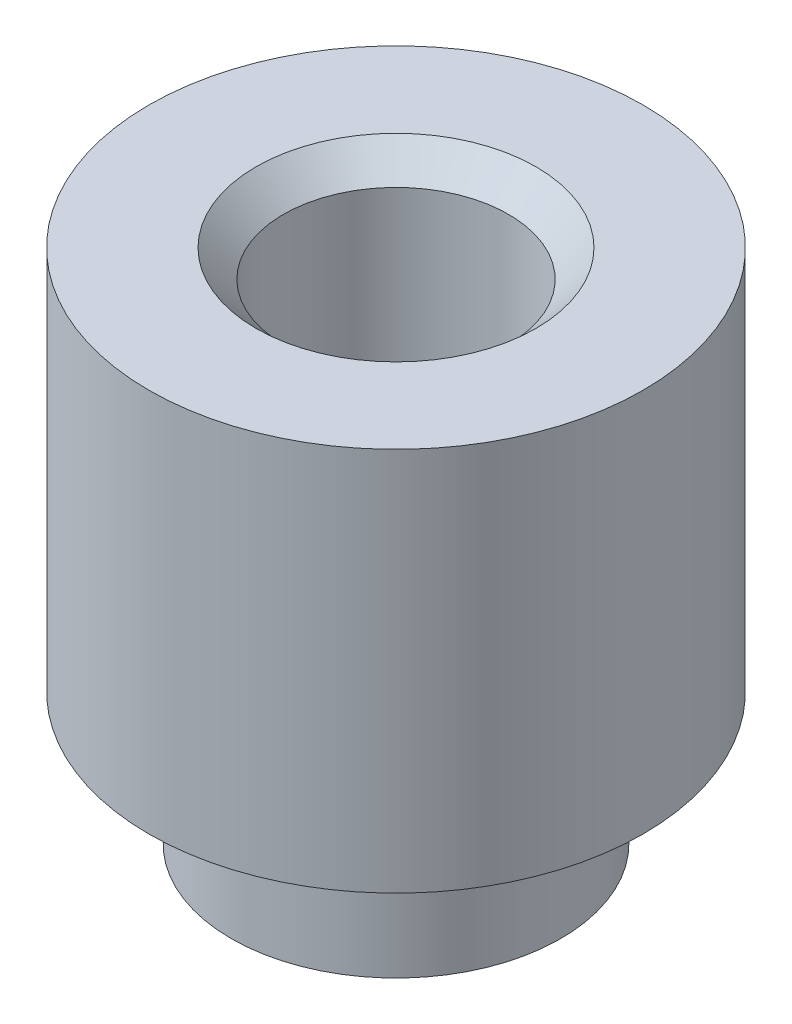
ISO-10303-21;
HEADER;
FILE_DESCRIPTION(('STEP AP214'),'2;1');
FILE_NAME('part.step','',(''),(''),'','','');
FILE_SCHEMA(('AUTOMOTIVE_DESIGN { 1 0 10303 214 1 1 1 1 }'));
ENDSEC;
DATA;
#1=APPLICATION_CONTEXT('core data for automotive mechanical design processes');
#2=APPLICATION_PROTOCOL_DEFINITION('international standard','automotive_design',2000,#1);
#3=PRODUCT_CONTEXT('',#1,'mechanical');
#4=PRODUCT('Part','Part','',(#3));
#5=PRODUCT_RELATED_PRODUCT_CATEGORY('part','',(#4));
#6=PRODUCT_DEFINITION_FORMATION('','',#4);
#7=PRODUCT_DEFINITION_CONTEXT('part definition',#1,'design');
#8=PRODUCT_DEFINITION('design','',#6,#7);
#9=PRODUCT_DEFINITION_SHAPE('','',#8);
#10=(LENGTH_UNIT() NAMED_UNIT(*) SI_UNIT(.MILLI.,.METRE.));
#11=(NAMED_UNIT(*) PLANE_ANGLE_UNIT() SI_UNIT($,.RADIAN.));
#12=(NAMED_UNIT(*) SI_UNIT($,.STERADIAN.) SOLID_ANGLE_UNIT());
#13=UNCERTAINTY_MEASURE_WITH_UNIT(LENGTH_MEASURE(1.E-05),#10,'distance_accuracy_value','');
#14=(GEOMETRIC_REPRESENTATION_CONTEXT(3) GLOBAL_UNCERTAINTY_ASSIGNED_CONTEXT((#13)) GLOBAL_UNIT_ASSIGNED_CONTEXT((#10,
#11,#12)) REPRESENTATION_CONTEXT('',''));
#15=CARTESIAN_POINT('',(0.,0.,0.));
#16=DIRECTION('',(0.,0.,1.));
#17=DIRECTION('',(1.,0.,0.));
#18=AXIS2_PLACEMENT_3D('',#15,#16,#17);
#19=CARTESIAN_POINT('',(0.,1.2,0.));
#20=DIRECTION('',(0.,-1.,0.));
#21=DIRECTION('',(0.,0.,-1.));
#22=AXIS2_PLACEMENT_3D('',#19,#20,#21);
#23=CYLINDRICAL_SURFACE('',#22,1.5);
#24=CARTESIAN_POINT('',(0.,1.2,0.));
#25=DIRECTION('',(0.,1.,0.));
#26=DIRECTION('',(0.,0.,1.));
#27=AXIS2_PLACEMENT_3D('',#24,#25,#26);
#28=CIRCLE('',#27,1.5);
#29=CARTESIAN_POINT('',(0.,1.2,1.5));
#30=VERTEX_POINT('',#29);
#31=EDGE_CURVE('E10',#30,#30,#28,.T.);
#32=ORIENTED_EDGE('',*,*,#31,.F.);
#33=EDGE_LOOP('',(#32));
#34=FACE_BOUND('',#33,.T.);
#35=CARTESIAN_POINT('',(0.,0.,0.));
#36=DIRECTION('',(0.,1.,0.));
#37=DIRECTION('',(0.,0.,1.));
#38=AXIS2_PLACEMENT_3D('',#35,#36,#37);
#39=CIRCLE('',#38,1.5);
#40=CARTESIAN_POINT('',(0.,0.,1.5));
#41=VERTEX_POINT('',#40);
#42=EDGE_CURVE('E42',#41,#41,#39,.T.);
#43=ORIENTED_EDGE('',*,*,#42,.T.);
#44=EDGE_LOOP('',(#43));
#45=FACE_BOUND('',#44,.T.);
#46=ADVANCED_FACE('F39',(#34,#45),#23,.T.);
#47=CARTESIAN_POINT('',(0.,0.,0.));
#48=DIRECTION('',(0.,1.,0.));
#49=DIRECTION('',(0.,0.,1.));
#50=AXIS2_PLACEMENT_3D('',#47,#48,#49);
#51=PLANE('',#50);
#52=CARTESIAN_POINT('',(0.,0.,0.));
#53=DIRECTION('',(0.,1.,0.));
#54=DIRECTION('',(0.,0.,1.));
#55=AXIS2_PLACEMENT_3D('',#52,#53,#54);
#56=CIRCLE('',#55,1.025);
#57=CARTESIAN_POINT('',(0.,0.,1.025));
#58=VERTEX_POINT('',#57);
#59=EDGE_CURVE('E54',#58,#58,#56,.T.);
#60=ORIENTED_EDGE('',*,*,#59,.T.);
#61=EDGE_LOOP('',(#60));
#62=FACE_BOUND('',#61,.T.);
#63=ORIENTED_EDGE('',*,*,#42,.F.);
#64=EDGE_LOOP('',(#63));
#65=FACE_BOUND('',#64,.T.);
#66=ADVANCED_FACE('F78',(#62,#65),#51,.F.);
#67=CARTESIAN_POINT('',(0.,4.7,0.));
#68=DIRECTION('',(0.,-1.,0.));
#69=DIRECTION('',(0.,0.,-1.));
#70=AXIS2_PLACEMENT_3D('',#67,#68,#69);
#71=CYLINDRICAL_SURFACE('',#70,2.25);
#72=CARTESIAN_POINT('',(0.,4.7,0.));
#73=DIRECTION('',(0.,1.,0.));
#74=DIRECTION('',(0.,0.,1.));
#75=AXIS2_PLACEMENT_3D('',#72,#73,#74);
#76=CIRCLE('',#75,2.25);
#77=CARTESIAN_POINT('',(0.,4.7,2.25));
#78=VERTEX_POINT('',#77);
#79=EDGE_CURVE('E49',#78,#78,#76,.T.);
#80=ORIENTED_EDGE('',*,*,#79,.F.);
#81=EDGE_LOOP('',(#80));
#82=FACE_BOUND('',#81,.T.);
#83=CARTESIAN_POINT('',(0.,1.2,0.));
#84=DIRECTION('',(0.,1.,0.));
#85=DIRECTION('',(0.,0.,1.));
#86=AXIS2_PLACEMENT_3D('',#83,#84,#85);
#87=CIRCLE('',#86,2.25);
#88=CARTESIAN_POINT('',(0.,1.2,2.25));
#89=VERTEX_POINT('',#88);
#90=EDGE_CURVE('E51',#89,#89,#87,.T.);
#91=ORIENTED_EDGE('',*,*,#90,.T.);
#92=EDGE_LOOP('',(#91));
#93=FACE_BOUND('',#92,.T.);
#94=ADVANCED_FACE('F72',(#82,#93),#71,.T.);
#95=CARTESIAN_POINT('',(0.,4.7,0.));
#96=DIRECTION('',(0.,1.,0.));
#97=DIRECTION('',(0.,0.,1.));
#98=AXIS2_PLACEMENT_3D('',#95,#96,#97);
#99=PLANE('',#98);
#100=CARTESIAN_POINT('',(0.,4.7,0.));
#101=DIRECTION('',(0.,1.,0.));
#102=DIRECTION('',(0.,0.,1.));
#103=AXIS2_PLACEMENT_3D('',#100,#101,#102);
#104=CIRCLE('',#103,1.275);
#105=CARTESIAN_POINT('',(0.,4.7,1.275));
#106=VERTEX_POINT('',#105);
#107=EDGE_CURVE('E62',#106,#106,#104,.T.);
#108=ORIENTED_EDGE('',*,*,#107,.F.);
#109=EDGE_LOOP('',(#108));
#110=FACE_BOUND('',#109,.T.);
#111=ORIENTED_EDGE('',*,*,#79,.T.);
#112=EDGE_LOOP('',(#111));
#113=FACE_BOUND('',#112,.T.);
#114=ADVANCED_FACE('F68',(#110,#113),#99,.T.);
#115=CARTESIAN_POINT('',(0.,1.2,0.));
#116=DIRECTION('',(0.,1.,0.));
#117=DIRECTION('',(0.,0.,1.));
#118=AXIS2_PLACEMENT_3D('',#115,#116,#117);
#119=PLANE('',#118);
#120=ORIENTED_EDGE('',*,*,#31,.T.);
#121=EDGE_LOOP('',(#120));
#122=FACE_BOUND('',#121,.T.);
#123=ORIENTED_EDGE('',*,*,#90,.F.);
#124=EDGE_LOOP('',(#123));
#125=FACE_BOUND('',#124,.T.);
#126=ADVANCED_FACE('F71',(#122,#125),#119,.F.);
#127=CARTESIAN_POINT('',(0.,4.7,0.));
#128=DIRECTION('',(0.,1.,0.));
#129=DIRECTION('',(0.,0.,1.));
#130=AXIS2_PLACEMENT_3D('',#127,#128,#129);
#131=CYLINDRICAL_SURFACE('',#130,1.025);
#132=ORIENTED_EDGE('',*,*,#59,.F.);
#133=EDGE_LOOP('',(#132));
#134=FACE_BOUND('',#133,.T.);
#135=CARTESIAN_POINT('',(0.,4.45,0.));
#136=DIRECTION('',(0.,1.,0.));
#137=DIRECTION('',(0.,0.,1.));
#138=AXIS2_PLACEMENT_3D('',#135,#136,#137);
#139=CIRCLE('',#138,1.025);
#140=CARTESIAN_POINT('',(0.,4.45,1.025));
#141=VERTEX_POINT('',#140);
#142=EDGE_CURVE('E59',#141,#141,#139,.T.);
#143=ORIENTED_EDGE('',*,*,#142,.T.);
#144=EDGE_LOOP('',(#143));
#145=FACE_BOUND('',#144,.T.);
#146=ADVANCED_FACE('F83',(#134,#145),#131,.F.);
#147=CARTESIAN_POINT('',(0.,4.7,0.));
#148=DIRECTION('',(0.,1.,0.));
#149=DIRECTION('',(0.,0.,1.));
#150=AXIS2_PLACEMENT_3D('',#147,#148,#149);
#151=CONICAL_SURFACE('',#150,1.275,0.785398163397445);
#152=ORIENTED_EDGE('',*,*,#142,.F.);
#153=EDGE_LOOP('',(#152));
#154=FACE_BOUND('',#153,.T.);
#155=ORIENTED_EDGE('',*,*,#107,.T.);
#156=EDGE_LOOP('',(#155));
#157=FACE_BOUND('',#156,.T.);
#158=ADVANCED_FACE('F66',(#154,#157),#151,.F.);
#159=CLOSED_SHELL('',(#46,#66,#94,#114,#126,#146,#158));
#160=MANIFOLD_SOLID_BREP('B2',#159);
#161=ADVANCED_BREP_SHAPE_REPRESENTATION('',(#18,#160),#14);
#162=SHAPE_DEFINITION_REPRESENTATION(#9,#161);
ENDSEC;
END-ISO-10303-21;
